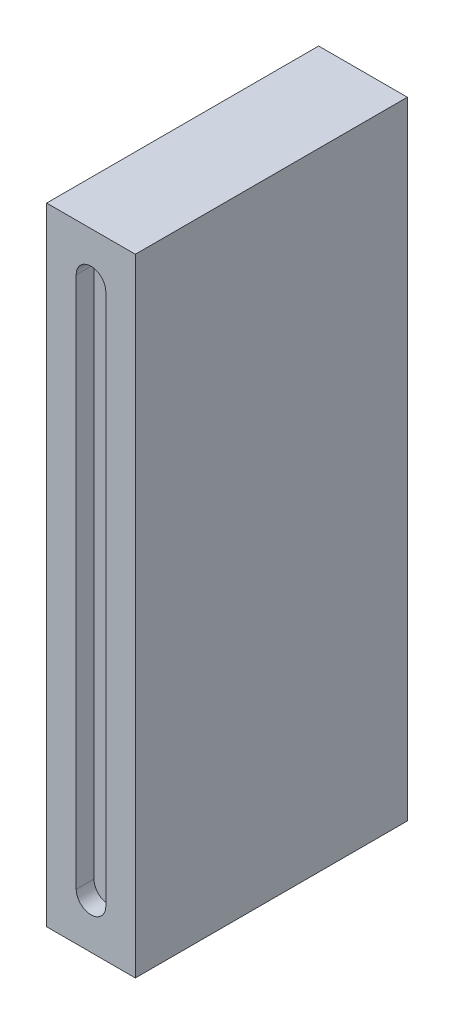
ISO-10303-21;
HEADER;
FILE_DESCRIPTION(('STEP AP214'),'2;1');
FILE_NAME('part.step','',(''),(''),'','','');
FILE_SCHEMA(('AUTOMOTIVE_DESIGN { 1 0 10303 214 1 1 1 1 }'));
ENDSEC;
DATA;
#1=APPLICATION_CONTEXT('core data for automotive mechanical design processes');
#2=APPLICATION_PROTOCOL_DEFINITION('international standard','automotive_design',2000,#1);
#3=PRODUCT_CONTEXT('',#1,'mechanical');
#4=PRODUCT('Part','Part','',(#3));
#5=PRODUCT_RELATED_PRODUCT_CATEGORY('part','',(#4));
#6=PRODUCT_DEFINITION_FORMATION('','',#4);
#7=PRODUCT_DEFINITION_CONTEXT('part definition',#1,'design');
#8=PRODUCT_DEFINITION('design','',#6,#7);
#9=PRODUCT_DEFINITION_SHAPE('','',#8);
#10=(LENGTH_UNIT() NAMED_UNIT(*) SI_UNIT(.MILLI.,.METRE.));
#11=(NAMED_UNIT(*) PLANE_ANGLE_UNIT() SI_UNIT($,.RADIAN.));
#12=(NAMED_UNIT(*) SI_UNIT($,.STERADIAN.) SOLID_ANGLE_UNIT());
#13=UNCERTAINTY_MEASURE_WITH_UNIT(LENGTH_MEASURE(1.E-05),#10,'distance_accuracy_value','');
#14=(GEOMETRIC_REPRESENTATION_CONTEXT(3) GLOBAL_UNCERTAINTY_ASSIGNED_CONTEXT((#13)) GLOBAL_UNIT_ASSIGNED_CONTEXT((#10,
#11,#12)) REPRESENTATION_CONTEXT('',''));
#15=CARTESIAN_POINT('',(0.,0.,0.));
#16=DIRECTION('',(0.,0.,1.));
#17=DIRECTION('',(1.,0.,0.));
#18=AXIS2_PLACEMENT_3D('',#15,#16,#17);
#19=CARTESIAN_POINT('',(0.,0.,-41.));
#20=DIRECTION('',(0.,0.,-1.));
#21=DIRECTION('',(1.,0.,0.));
#22=AXIS2_PLACEMENT_3D('',#19,#20,#21);
#23=PLANE('',#22);
#24=DIRECTION('',(0.,-1.,0.));
#25=VECTOR('',#24,1.);
#26=CARTESIAN_POINT('',(-7.5,-50.,-41.));
#27=LINE('',#26,#25);
#28=CARTESIAN_POINT('',(-7.5,53.,-41.));
#29=VERTEX_POINT('',#28);
#30=CARTESIAN_POINT('',(-7.5,-53.,-41.));
#31=VERTEX_POINT('',#30);
#32=EDGE_CURVE('E252',#29,#31,#27,.T.);
#33=ORIENTED_EDGE('',*,*,#32,.F.);
#34=DIRECTION('',(1.,0.,0.));
#35=VECTOR('',#34,1.);
#36=CARTESIAN_POINT('',(-7.5,53.,-41.));
#37=LINE('',#36,#35);
#38=CARTESIAN_POINT('',(7.5,53.,-41.));
#39=VERTEX_POINT('',#38);
#40=EDGE_CURVE('E171',#29,#39,#37,.T.);
#41=ORIENTED_EDGE('',*,*,#40,.T.);
#42=DIRECTION('',(0.,1.,0.));
#43=VECTOR('',#42,1.);
#44=CARTESIAN_POINT('',(7.5,-50.,-41.));
#45=LINE('',#44,#43);
#46=CARTESIAN_POINT('',(7.5,-53.,-41.));
#47=VERTEX_POINT('',#46);
#48=EDGE_CURVE('E254',#47,#39,#45,.T.);
#49=ORIENTED_EDGE('',*,*,#48,.F.);
#50=DIRECTION('',(1.,0.,0.));
#51=VECTOR('',#50,1.);
#52=CARTESIAN_POINT('',(-7.5,-53.,-41.));
#53=LINE('',#52,#51);
#54=EDGE_CURVE('E184',#31,#47,#53,.T.);
#55=ORIENTED_EDGE('',*,*,#54,.F.);
#56=EDGE_LOOP('',(#33,#41,#49,#55));
#57=FACE_BOUND('',#56,.T.);
#58=DIRECTION('',(0.,1.,0.));
#59=VECTOR('',#58,1.);
#60=CARTESIAN_POINT('',(2.49999999999999,45.,-41.));
#61=LINE('',#60,#59);
#62=CARTESIAN_POINT('',(2.50000000000001,-45.,-41.));
#63=VERTEX_POINT('',#62);
#64=CARTESIAN_POINT('',(2.49999999999999,45.,-41.));
#65=VERTEX_POINT('',#64);
#66=EDGE_CURVE('E206',#63,#65,#61,.T.);
#67=ORIENTED_EDGE('',*,*,#66,.T.);
#68=CARTESIAN_POINT('',(0.,45.,-41.));
#69=DIRECTION('',(0.,0.,1.));
#70=DIRECTION('',(1.,0.,0.));
#71=AXIS2_PLACEMENT_3D('',#68,#69,#70);
#72=CIRCLE('',#71,2.49999999999999);
#73=CARTESIAN_POINT('',(-2.49999999999999,45.,-41.));
#74=VERTEX_POINT('',#73);
#75=EDGE_CURVE('E55',#65,#74,#72,.T.);
#76=ORIENTED_EDGE('',*,*,#75,.T.);
#77=DIRECTION('',(0.,-1.,0.));
#78=VECTOR('',#77,1.);
#79=CARTESIAN_POINT('',(-2.49999999999999,45.,-41.));
#80=LINE('',#79,#78);
#81=CARTESIAN_POINT('',(-2.5,-45.,-41.));
#82=VERTEX_POINT('',#81);
#83=EDGE_CURVE('E198',#74,#82,#80,.T.);
#84=ORIENTED_EDGE('',*,*,#83,.T.);
#85=CARTESIAN_POINT('',(0.,-45.,-41.));
#86=DIRECTION('',(0.,0.,1.));
#87=DIRECTION('',(1.,0.,0.));
#88=AXIS2_PLACEMENT_3D('',#85,#86,#87);
#89=CIRCLE('',#88,2.5);
#90=EDGE_CURVE('E209',#82,#63,#89,.T.);
#91=ORIENTED_EDGE('',*,*,#90,.T.);
#92=EDGE_LOOP('',(#67,#76,#84,#91));
#93=FACE_BOUND('',#92,.T.);
#94=ADVANCED_FACE('F38',(#57,#93),#23,.T.);
#95=CARTESIAN_POINT('',(-7.5,-50.,5.));
#96=DIRECTION('',(1.,0.,0.));
#97=DIRECTION('',(0.,0.,-1.));
#98=AXIS2_PLACEMENT_3D('',#95,#96,#97);
#99=PLANE('',#98);
#100=DIRECTION('',(0.,-1.,0.));
#101=VECTOR('',#100,1.);
#102=CARTESIAN_POINT('',(-7.5,-50.,-36.));
#103=LINE('',#102,#101);
#104=CARTESIAN_POINT('',(-7.5,50.,-36.));
#105=VERTEX_POINT('',#104);
#106=CARTESIAN_POINT('',(-7.5,-50.,-36.));
#107=VERTEX_POINT('',#106);
#108=EDGE_CURVE('E246',#105,#107,#103,.T.);
#109=ORIENTED_EDGE('',*,*,#108,.F.);
#110=DIRECTION('',(0.,0.,-1.));
#111=VECTOR('',#110,1.);
#112=CARTESIAN_POINT('',(-7.5,50.,5.));
#113=LINE('',#112,#111);
#114=CARTESIAN_POINT('',(-7.5,50.,0.));
#115=VERTEX_POINT('',#114);
#116=EDGE_CURVE('E172',#115,#105,#113,.T.);
#117=ORIENTED_EDGE('',*,*,#116,.F.);
#118=DIRECTION('',(0.,-1.,0.));
#119=VECTOR('',#118,1.);
#120=CARTESIAN_POINT('',(-7.5,-50.,0.));
#121=LINE('',#120,#119);
#122=CARTESIAN_POINT('',(-7.5,-50.,0.));
#123=VERTEX_POINT('',#122);
#124=EDGE_CURVE('E273',#115,#123,#121,.T.);
#125=ORIENTED_EDGE('',*,*,#124,.T.);
#126=DIRECTION('',(0.,0.,-1.));
#127=VECTOR('',#126,1.);
#128=CARTESIAN_POINT('',(-7.5,-50.,5.));
#129=LINE('',#128,#127);
#130=EDGE_CURVE('E180',#123,#107,#129,.T.);
#131=ORIENTED_EDGE('',*,*,#130,.T.);
#132=EDGE_LOOP('',(#109,#117,#125,#131));
#133=FACE_BOUND('',#132,.T.);
#134=DIRECTION('',(0.,0.,-1.));
#135=VECTOR('',#134,1.);
#136=CARTESIAN_POINT('',(-7.5,53.,5.));
#137=LINE('',#136,#135);
#138=CARTESIAN_POINT('',(-7.5,53.,5.));
#139=VERTEX_POINT('',#138);
#140=EDGE_CURVE('E155',#139,#29,#137,.T.);
#141=ORIENTED_EDGE('',*,*,#140,.T.);
#142=ORIENTED_EDGE('',*,*,#32,.T.);
#143=DIRECTION('',(0.,0.,-1.));
#144=VECTOR('',#143,1.);
#145=CARTESIAN_POINT('',(-7.5,-53.,5.));
#146=LINE('',#145,#144);
#147=CARTESIAN_POINT('',(-7.5,-53.,5.));
#148=VERTEX_POINT('',#147);
#149=EDGE_CURVE('E158',#148,#31,#146,.T.);
#150=ORIENTED_EDGE('',*,*,#149,.F.);
#151=DIRECTION('',(0.,-1.,0.));
#152=VECTOR('',#151,1.);
#153=CARTESIAN_POINT('',(-7.5,-50.,5.));
#154=LINE('',#153,#152);
#155=EDGE_CURVE('E47',#139,#148,#154,.T.);
#156=ORIENTED_EDGE('',*,*,#155,.F.);
#157=EDGE_LOOP('',(#141,#142,#150,#156));
#158=FACE_BOUND('',#157,.T.);
#159=ADVANCED_FACE('F40',(#133,#158),#99,.F.);
#160=CARTESIAN_POINT('',(7.5,-50.,5.));
#161=DIRECTION('',(-1.,0.,0.));
#162=DIRECTION('',(0.,0.,1.));
#163=AXIS2_PLACEMENT_3D('',#160,#161,#162);
#164=PLANE('',#163);
#165=DIRECTION('',(0.,1.,0.));
#166=VECTOR('',#165,1.);
#167=CARTESIAN_POINT('',(7.5,-50.,5.));
#168=LINE('',#167,#166);
#169=CARTESIAN_POINT('',(7.5,-53.,5.));
#170=VERTEX_POINT('',#169);
#171=CARTESIAN_POINT('',(7.5,53.,5.));
#172=VERTEX_POINT('',#171);
#173=EDGE_CURVE('E11',#170,#172,#168,.T.);
#174=ORIENTED_EDGE('',*,*,#173,.F.);
#175=DIRECTION('',(0.,0.,1.));
#176=VECTOR('',#175,1.);
#177=CARTESIAN_POINT('',(7.5,-53.,5.));
#178=LINE('',#177,#176);
#179=EDGE_CURVE('E187',#47,#170,#178,.T.);
#180=ORIENTED_EDGE('',*,*,#179,.F.);
#181=ORIENTED_EDGE('',*,*,#48,.T.);
#182=DIRECTION('',(0.,0.,1.));
#183=VECTOR('',#182,1.);
#184=CARTESIAN_POINT('',(7.5,53.,5.));
#185=LINE('',#184,#183);
#186=EDGE_CURVE('E175',#39,#172,#185,.T.);
#187=ORIENTED_EDGE('',*,*,#186,.T.);
#188=EDGE_LOOP('',(#174,#180,#181,#187));
#189=FACE_BOUND('',#188,.T.);
#190=ADVANCED_FACE('F302',(#189),#164,.F.);
#191=CARTESIAN_POINT('',(0.,0.,5.));
#192=DIRECTION('',(0.,0.,1.));
#193=DIRECTION('',(1.,0.,0.));
#194=AXIS2_PLACEMENT_3D('',#191,#192,#193);
#195=PLANE('',#194);
#196=CARTESIAN_POINT('',(0.,45.,5.));
#197=DIRECTION('',(0.,0.,1.));
#198=DIRECTION('',(1.,0.,0.));
#199=AXIS2_PLACEMENT_3D('',#196,#197,#198);
#200=CIRCLE('',#199,2.49999999999999);
#201=CARTESIAN_POINT('',(2.49999999999999,45.,5.));
#202=VERTEX_POINT('',#201);
#203=CARTESIAN_POINT('',(-2.49999999999999,45.,5.));
#204=VERTEX_POINT('',#203);
#205=EDGE_CURVE('E63',#202,#204,#200,.T.);
#206=ORIENTED_EDGE('',*,*,#205,.F.);
#207=DIRECTION('',(0.,1.,0.));
#208=VECTOR('',#207,1.);
#209=CARTESIAN_POINT('',(2.49999999999999,45.,5.));
#210=LINE('',#209,#208);
#211=CARTESIAN_POINT('',(2.50000000000001,-45.,5.));
#212=VERTEX_POINT('',#211);
#213=EDGE_CURVE('E225',#212,#202,#210,.T.);
#214=ORIENTED_EDGE('',*,*,#213,.F.);
#215=CARTESIAN_POINT('',(0.,-45.,5.));
#216=DIRECTION('',(0.,0.,1.));
#217=DIRECTION('',(1.,0.,0.));
#218=AXIS2_PLACEMENT_3D('',#215,#216,#217);
#219=CIRCLE('',#218,2.5);
#220=CARTESIAN_POINT('',(-2.5,-45.,5.));
#221=VERTEX_POINT('',#220);
#222=EDGE_CURVE('E239',#221,#212,#219,.T.);
#223=ORIENTED_EDGE('',*,*,#222,.F.);
#224=DIRECTION('',(0.,-1.,0.));
#225=VECTOR('',#224,1.);
#226=CARTESIAN_POINT('',(-2.49999999999999,45.,5.));
#227=LINE('',#226,#225);
#228=EDGE_CURVE('E236',#204,#221,#227,.T.);
#229=ORIENTED_EDGE('',*,*,#228,.F.);
#230=EDGE_LOOP('',(#206,#214,#223,#229));
#231=FACE_BOUND('',#230,.T.);
#232=ORIENTED_EDGE('',*,*,#155,.T.);
#233=DIRECTION('',(-1.,0.,0.));
#234=VECTOR('',#233,1.);
#235=CARTESIAN_POINT('',(-7.5,-53.,5.));
#236=LINE('',#235,#234);
#237=EDGE_CURVE('E190',#170,#148,#236,.T.);
#238=ORIENTED_EDGE('',*,*,#237,.F.);
#239=ORIENTED_EDGE('',*,*,#173,.T.);
#240=DIRECTION('',(-1.,0.,0.));
#241=VECTOR('',#240,1.);
#242=CARTESIAN_POINT('',(-7.5,53.,5.));
#243=LINE('',#242,#241);
#244=EDGE_CURVE('E168',#172,#139,#243,.T.);
#245=ORIENTED_EDGE('',*,*,#244,.T.);
#246=EDGE_LOOP('',(#232,#238,#239,#245));
#247=FACE_BOUND('',#246,.T.);
#248=ADVANCED_FACE('F174',(#231,#247),#195,.T.);
#249=CARTESIAN_POINT('',(0.,0.,0.));
#250=DIRECTION('',(0.,0.,1.));
#251=DIRECTION('',(1.,0.,0.));
#252=AXIS2_PLACEMENT_3D('',#249,#250,#251);
#253=PLANE('',#252);
#254=DIRECTION('',(-1.,0.,0.));
#255=VECTOR('',#254,1.);
#256=CARTESIAN_POINT('',(7.5,50.,0.));
#257=LINE('',#256,#255);
#258=CARTESIAN_POINT('',(2.5,50.,0.));
#259=VERTEX_POINT('',#258);
#260=EDGE_CURVE('E42',#259,#115,#257,.T.);
#261=ORIENTED_EDGE('',*,*,#260,.F.);
#262=DIRECTION('',(0.,-1.,0.));
#263=VECTOR('',#262,1.);
#264=CARTESIAN_POINT('',(2.5,-50.,0.));
#265=LINE('',#264,#263);
#266=CARTESIAN_POINT('',(2.5,-50.,0.));
#267=VERTEX_POINT('',#266);
#268=EDGE_CURVE('E257',#259,#267,#265,.T.);
#269=ORIENTED_EDGE('',*,*,#268,.T.);
#270=DIRECTION('',(1.,0.,0.));
#271=VECTOR('',#270,1.);
#272=CARTESIAN_POINT('',(7.5,-50.,0.));
#273=LINE('',#272,#271);
#274=EDGE_CURVE('E276',#123,#267,#273,.T.);
#275=ORIENTED_EDGE('',*,*,#274,.F.);
#276=ORIENTED_EDGE('',*,*,#124,.F.);
#277=EDGE_LOOP('',(#261,#269,#275,#276));
#278=FACE_BOUND('',#277,.T.);
#279=ADVANCED_FACE('F294',(#278),#253,.F.);
#280=CARTESIAN_POINT('',(2.5,0.,0.));
#281=DIRECTION('',(-1.,0.,0.));
#282=DIRECTION('',(0.,0.,1.));
#283=AXIS2_PLACEMENT_3D('',#280,#281,#282);
#284=PLANE('',#283);
#285=ORIENTED_EDGE('',*,*,#268,.F.);
#286=DIRECTION('',(0.,0.,1.));
#287=VECTOR('',#286,1.);
#288=CARTESIAN_POINT('',(2.5,50.,0.));
#289=LINE('',#288,#287);
#290=CARTESIAN_POINT('',(2.5,50.,-36.));
#291=VERTEX_POINT('',#290);
#292=EDGE_CURVE('E271',#291,#259,#289,.T.);
#293=ORIENTED_EDGE('',*,*,#292,.F.);
#294=DIRECTION('',(0.,1.,0.));
#295=VECTOR('',#294,1.);
#296=CARTESIAN_POINT('',(2.5,-50.,-36.));
#297=LINE('',#296,#295);
#298=CARTESIAN_POINT('',(2.5,-50.,-36.));
#299=VERTEX_POINT('',#298);
#300=EDGE_CURVE('E268',#299,#291,#297,.T.);
#301=ORIENTED_EDGE('',*,*,#300,.F.);
#302=DIRECTION('',(0.,0.,-1.));
#303=VECTOR('',#302,1.);
#304=CARTESIAN_POINT('',(2.5,-50.,0.));
#305=LINE('',#304,#303);
#306=EDGE_CURVE('E266',#267,#299,#305,.T.);
#307=ORIENTED_EDGE('',*,*,#306,.F.);
#308=EDGE_LOOP('',(#285,#293,#301,#307));
#309=FACE_BOUND('',#308,.T.);
#310=ADVANCED_FACE('F293',(#309),#284,.T.);
#311=CARTESIAN_POINT('',(0.,0.,-36.));
#312=DIRECTION('',(0.,0.,-1.));
#313=DIRECTION('',(1.,0.,0.));
#314=AXIS2_PLACEMENT_3D('',#311,#312,#313);
#315=PLANE('',#314);
#316=DIRECTION('',(1.,0.,0.));
#317=VECTOR('',#316,1.);
#318=CARTESIAN_POINT('',(7.5,-50.,-36.));
#319=LINE('',#318,#317);
#320=EDGE_CURVE('E255',#107,#299,#319,.T.);
#321=ORIENTED_EDGE('',*,*,#320,.T.);
#322=ORIENTED_EDGE('',*,*,#300,.T.);
#323=DIRECTION('',(-1.,0.,0.));
#324=VECTOR('',#323,1.);
#325=CARTESIAN_POINT('',(7.5,50.,-36.));
#326=LINE('',#325,#324);
#327=EDGE_CURVE('E260',#291,#105,#326,.T.);
#328=ORIENTED_EDGE('',*,*,#327,.T.);
#329=ORIENTED_EDGE('',*,*,#108,.T.);
#330=EDGE_LOOP('',(#321,#322,#328,#329));
#331=FACE_BOUND('',#330,.T.);
#332=ADVANCED_FACE('F290',(#331),#315,.F.);
#333=CARTESIAN_POINT('',(0.,45.,2.));
#334=DIRECTION('',(0.,0.,1.));
#335=DIRECTION('',(1.,0.,0.));
#336=AXIS2_PLACEMENT_3D('',#333,#334,#335);
#337=CYLINDRICAL_SURFACE('',#336,2.49999999999999);
#338=ORIENTED_EDGE('',*,*,#205,.T.);
#339=DIRECTION('',(0.,0.,1.));
#340=VECTOR('',#339,1.);
#341=CARTESIAN_POINT('',(-2.49999999999999,45.,2.));
#342=LINE('',#341,#340);
#343=CARTESIAN_POINT('',(-2.49999999999999,45.,2.));
#344=VERTEX_POINT('',#343);
#345=EDGE_CURVE('E234',#344,#204,#342,.T.);
#346=ORIENTED_EDGE('',*,*,#345,.F.);
#347=CARTESIAN_POINT('',(0.,45.,2.));
#348=DIRECTION('',(0.,0.,1.));
#349=DIRECTION('',(1.,0.,0.));
#350=AXIS2_PLACEMENT_3D('',#347,#348,#349);
#351=CIRCLE('',#350,2.49999999999999);
#352=CARTESIAN_POINT('',(2.49999999999999,45.,2.));
#353=VERTEX_POINT('',#352);
#354=EDGE_CURVE('E221',#353,#344,#351,.T.);
#355=ORIENTED_EDGE('',*,*,#354,.F.);
#356=DIRECTION('',(0.,0.,1.));
#357=VECTOR('',#356,1.);
#358=CARTESIAN_POINT('',(2.49999999999999,45.,2.));
#359=LINE('',#358,#357);
#360=EDGE_CURVE('E244',#353,#202,#359,.T.);
#361=ORIENTED_EDGE('',*,*,#360,.T.);
#362=EDGE_LOOP('',(#338,#346,#355,#361));
#363=FACE_BOUND('',#362,.T.);
#364=ADVANCED_FACE('F314',(#363),#337,.F.);
#365=CARTESIAN_POINT('',(2.49999999999999,45.,2.));
#366=DIRECTION('',(1.,0.,0.));
#367=DIRECTION('',(0.,1.,0.));
#368=AXIS2_PLACEMENT_3D('',#365,#366,#367);
#369=PLANE('',#368);
#370=ORIENTED_EDGE('',*,*,#213,.T.);
#371=ORIENTED_EDGE('',*,*,#360,.F.);
#372=DIRECTION('',(0.,1.,0.));
#373=VECTOR('',#372,1.);
#374=CARTESIAN_POINT('',(2.49999999999999,45.,2.));
#375=LINE('',#374,#373);
#376=CARTESIAN_POINT('',(2.50000000000001,-45.,2.));
#377=VERTEX_POINT('',#376);
#378=EDGE_CURVE('E231',#377,#353,#375,.T.);
#379=ORIENTED_EDGE('',*,*,#378,.F.);
#380=DIRECTION('',(0.,0.,1.));
#381=VECTOR('',#380,1.);
#382=CARTESIAN_POINT('',(2.50000000000001,-45.,2.));
#383=LINE('',#382,#381);
#384=EDGE_CURVE('E247',#377,#212,#383,.T.);
#385=ORIENTED_EDGE('',*,*,#384,.T.);
#386=EDGE_LOOP('',(#370,#371,#379,#385));
#387=FACE_BOUND('',#386,.T.);
#388=ADVANCED_FACE('F320',(#387),#369,.F.);
#389=CARTESIAN_POINT('',(0.,-45.,2.));
#390=DIRECTION('',(0.,0.,1.));
#391=DIRECTION('',(1.,0.,0.));
#392=AXIS2_PLACEMENT_3D('',#389,#390,#391);
#393=CYLINDRICAL_SURFACE('',#392,2.5);
#394=ORIENTED_EDGE('',*,*,#222,.T.);
#395=ORIENTED_EDGE('',*,*,#384,.F.);
#396=CARTESIAN_POINT('',(0.,-45.,2.));
#397=DIRECTION('',(0.,0.,1.));
#398=DIRECTION('',(1.,0.,0.));
#399=AXIS2_PLACEMENT_3D('',#396,#397,#398);
#400=CIRCLE('',#399,2.5);
#401=CARTESIAN_POINT('',(-2.5,-45.,2.));
#402=VERTEX_POINT('',#401);
#403=EDGE_CURVE('E228',#402,#377,#400,.T.);
#404=ORIENTED_EDGE('',*,*,#403,.F.);
#405=DIRECTION('',(0.,0.,1.));
#406=VECTOR('',#405,1.);
#407=CARTESIAN_POINT('',(-2.5,-45.,2.));
#408=LINE('',#407,#406);
#409=EDGE_CURVE('E249',#402,#221,#408,.T.);
#410=ORIENTED_EDGE('',*,*,#409,.T.);
#411=EDGE_LOOP('',(#394,#395,#404,#410));
#412=FACE_BOUND('',#411,.T.);
#413=ADVANCED_FACE('F324',(#412),#393,.F.);
#414=CARTESIAN_POINT('',(-2.49999999999999,45.,2.));
#415=DIRECTION('',(-1.,0.,0.));
#416=DIRECTION('',(0.,0.,1.));
#417=AXIS2_PLACEMENT_3D('',#414,#415,#416);
#418=PLANE('',#417);
#419=ORIENTED_EDGE('',*,*,#228,.T.);
#420=ORIENTED_EDGE('',*,*,#409,.F.);
#421=DIRECTION('',(0.,-1.,0.));
#422=VECTOR('',#421,1.);
#423=CARTESIAN_POINT('',(-2.49999999999999,45.,2.));
#424=LINE('',#423,#422);
#425=EDGE_CURVE('E224',#344,#402,#424,.T.);
#426=ORIENTED_EDGE('',*,*,#425,.F.);
#427=ORIENTED_EDGE('',*,*,#345,.T.);
#428=EDGE_LOOP('',(#419,#420,#426,#427));
#429=FACE_BOUND('',#428,.T.);
#430=ADVANCED_FACE('F330',(#429),#418,.F.);
#431=CARTESIAN_POINT('',(0.,45.,2.));
#432=DIRECTION('',(0.,0.,1.));
#433=DIRECTION('',(1.,0.,0.));
#434=AXIS2_PLACEMENT_3D('',#431,#432,#433);
#435=PLANE('',#434);
#436=ORIENTED_EDGE('',*,*,#354,.T.);
#437=ORIENTED_EDGE('',*,*,#425,.T.);
#438=ORIENTED_EDGE('',*,*,#403,.T.);
#439=ORIENTED_EDGE('',*,*,#378,.T.);
#440=EDGE_LOOP('',(#436,#437,#438,#439));
#441=FACE_BOUND('',#440,.T.);
#442=ADVANCED_FACE('F334',(#441),#435,.T.);
#443=CARTESIAN_POINT('',(0.,45.,-38.));
#444=DIRECTION('',(0.,0.,-1.));
#445=DIRECTION('',(-1.,0.,0.));
#446=AXIS2_PLACEMENT_3D('',#443,#444,#445);
#447=CYLINDRICAL_SURFACE('',#446,2.49999999999999);
#448=ORIENTED_EDGE('',*,*,#75,.F.);
#449=DIRECTION('',(0.,0.,-1.));
#450=VECTOR('',#449,1.);
#451=CARTESIAN_POINT('',(2.49999999999999,45.,-38.));
#452=LINE('',#451,#450);
#453=CARTESIAN_POINT('',(2.49999999999999,45.,-38.));
#454=VERTEX_POINT('',#453);
#455=EDGE_CURVE('E204',#454,#65,#452,.T.);
#456=ORIENTED_EDGE('',*,*,#455,.F.);
#457=CARTESIAN_POINT('',(0.,45.,-38.));
#458=DIRECTION('',(0.,0.,1.));
#459=DIRECTION('',(1.,0.,0.));
#460=AXIS2_PLACEMENT_3D('',#457,#458,#459);
#461=CIRCLE('',#460,2.49999999999999);
#462=CARTESIAN_POINT('',(-2.49999999999999,45.,-38.));
#463=VERTEX_POINT('',#462);
#464=EDGE_CURVE('E194',#454,#463,#461,.T.);
#465=ORIENTED_EDGE('',*,*,#464,.T.);
#466=DIRECTION('',(0.,0.,-1.));
#467=VECTOR('',#466,1.);
#468=CARTESIAN_POINT('',(-2.49999999999999,45.,-38.));
#469=LINE('',#468,#467);
#470=EDGE_CURVE('E214',#463,#74,#469,.T.);
#471=ORIENTED_EDGE('',*,*,#470,.T.);
#472=EDGE_LOOP('',(#448,#456,#465,#471));
#473=FACE_BOUND('',#472,.T.);
#474=ADVANCED_FACE('F341',(#473),#447,.F.);
#475=CARTESIAN_POINT('',(-2.49999999999999,45.,-38.));
#476=DIRECTION('',(1.,0.,0.));
#477=DIRECTION('',(0.,0.,-1.));
#478=AXIS2_PLACEMENT_3D('',#475,#476,#477);
#479=PLANE('',#478);
#480=ORIENTED_EDGE('',*,*,#83,.F.);
#481=ORIENTED_EDGE('',*,*,#470,.F.);
#482=DIRECTION('',(0.,-1.,0.));
#483=VECTOR('',#482,1.);
#484=CARTESIAN_POINT('',(-2.49999999999999,45.,-38.));
#485=LINE('',#484,#483);
#486=CARTESIAN_POINT('',(-2.5,-45.,-38.));
#487=VERTEX_POINT('',#486);
#488=EDGE_CURVE('E202',#463,#487,#485,.T.);
#489=ORIENTED_EDGE('',*,*,#488,.T.);
#490=DIRECTION('',(0.,0.,-1.));
#491=VECTOR('',#490,1.);
#492=CARTESIAN_POINT('',(-2.5,-45.,-38.));
#493=LINE('',#492,#491);
#494=EDGE_CURVE('E216',#487,#82,#493,.T.);
#495=ORIENTED_EDGE('',*,*,#494,.T.);
#496=EDGE_LOOP('',(#480,#481,#489,#495));
#497=FACE_BOUND('',#496,.T.);
#498=ADVANCED_FACE('F353',(#497),#479,.T.);
#499=CARTESIAN_POINT('',(0.,-45.,-38.));
#500=DIRECTION('',(0.,0.,-1.));
#501=DIRECTION('',(-1.,0.,0.));
#502=AXIS2_PLACEMENT_3D('',#499,#500,#501);
#503=CYLINDRICAL_SURFACE('',#502,2.5);
#504=ORIENTED_EDGE('',*,*,#90,.F.);
#505=ORIENTED_EDGE('',*,*,#494,.F.);
#506=CARTESIAN_POINT('',(0.,-45.,-38.));
#507=DIRECTION('',(0.,0.,1.));
#508=DIRECTION('',(1.,0.,0.));
#509=AXIS2_PLACEMENT_3D('',#506,#507,#508);
#510=CIRCLE('',#509,2.5);
#511=CARTESIAN_POINT('',(2.50000000000001,-45.,-38.));
#512=VERTEX_POINT('',#511);
#513=EDGE_CURVE('E200',#487,#512,#510,.T.);
#514=ORIENTED_EDGE('',*,*,#513,.T.);
#515=DIRECTION('',(0.,0.,-1.));
#516=VECTOR('',#515,1.);
#517=CARTESIAN_POINT('',(2.50000000000001,-45.,-38.));
#518=LINE('',#517,#516);
#519=EDGE_CURVE('E218',#512,#63,#518,.T.);
#520=ORIENTED_EDGE('',*,*,#519,.T.);
#521=EDGE_LOOP('',(#504,#505,#514,#520));
#522=FACE_BOUND('',#521,.T.);
#523=ADVANCED_FACE('F357',(#522),#503,.F.);
#524=CARTESIAN_POINT('',(2.49999999999999,45.,-38.));
#525=DIRECTION('',(-1.,0.,0.));
#526=DIRECTION('',(0.,-1.,0.));
#527=AXIS2_PLACEMENT_3D('',#524,#525,#526);
#528=PLANE('',#527);
#529=ORIENTED_EDGE('',*,*,#66,.F.);
#530=ORIENTED_EDGE('',*,*,#519,.F.);
#531=DIRECTION('',(0.,1.,0.));
#532=VECTOR('',#531,1.);
#533=CARTESIAN_POINT('',(2.49999999999999,45.,-38.));
#534=LINE('',#533,#532);
#535=EDGE_CURVE('E197',#512,#454,#534,.T.);
#536=ORIENTED_EDGE('',*,*,#535,.T.);
#537=ORIENTED_EDGE('',*,*,#455,.T.);
#538=EDGE_LOOP('',(#529,#530,#536,#537));
#539=FACE_BOUND('',#538,.T.);
#540=ADVANCED_FACE('F361',(#539),#528,.T.);
#541=CARTESIAN_POINT('',(0.,45.,-38.));
#542=DIRECTION('',(0.,0.,-1.));
#543=DIRECTION('',(1.,0.,0.));
#544=AXIS2_PLACEMENT_3D('',#541,#542,#543);
#545=PLANE('',#544);
#546=ORIENTED_EDGE('',*,*,#464,.F.);
#547=ORIENTED_EDGE('',*,*,#535,.F.);
#548=ORIENTED_EDGE('',*,*,#513,.F.);
#549=ORIENTED_EDGE('',*,*,#488,.F.);
#550=EDGE_LOOP('',(#546,#547,#548,#549));
#551=FACE_BOUND('',#550,.T.);
#552=ADVANCED_FACE('F364',(#551),#545,.T.);
#553=CARTESIAN_POINT('',(0.,-50.,0.));
#554=DIRECTION('',(0.,-1.,0.));
#555=DIRECTION('',(1.,0.,0.));
#556=AXIS2_PLACEMENT_3D('',#553,#554,#555);
#557=PLANE('',#556);
#558=ORIENTED_EDGE('',*,*,#130,.F.);
#559=ORIENTED_EDGE('',*,*,#274,.T.);
#560=ORIENTED_EDGE('',*,*,#306,.T.);
#561=ORIENTED_EDGE('',*,*,#320,.F.);
#562=EDGE_LOOP('',(#558,#559,#560,#561));
#563=FACE_BOUND('',#562,.T.);
#564=ADVANCED_FACE('F371',(#563),#557,.F.);
#565=CARTESIAN_POINT('',(0.,-53.,0.));
#566=DIRECTION('',(0.,-1.,0.));
#567=DIRECTION('',(1.,0.,0.));
#568=AXIS2_PLACEMENT_3D('',#565,#566,#567);
#569=PLANE('',#568);
#570=ORIENTED_EDGE('',*,*,#149,.T.);
#571=ORIENTED_EDGE('',*,*,#54,.T.);
#572=ORIENTED_EDGE('',*,*,#179,.T.);
#573=ORIENTED_EDGE('',*,*,#237,.T.);
#574=EDGE_LOOP('',(#570,#571,#572,#573));
#575=FACE_BOUND('',#574,.T.);
#576=ADVANCED_FACE('F375',(#575),#569,.T.);
#577=CARTESIAN_POINT('',(0.,53.,0.));
#578=DIRECTION('',(0.,1.,0.));
#579=DIRECTION('',(1.,0.,0.));
#580=AXIS2_PLACEMENT_3D('',#577,#578,#579);
#581=PLANE('',#580);
#582=ORIENTED_EDGE('',*,*,#140,.F.);
#583=ORIENTED_EDGE('',*,*,#244,.F.);
#584=ORIENTED_EDGE('',*,*,#186,.F.);
#585=ORIENTED_EDGE('',*,*,#40,.F.);
#586=EDGE_LOOP('',(#582,#583,#584,#585));
#587=FACE_BOUND('',#586,.T.);
#588=ADVANCED_FACE('F166',(#587),#581,.T.);
#589=CARTESIAN_POINT('',(0.,50.,0.));
#590=DIRECTION('',(0.,1.,0.));
#591=DIRECTION('',(1.,0.,0.));
#592=AXIS2_PLACEMENT_3D('',#589,#590,#591);
#593=PLANE('',#592);
#594=ORIENTED_EDGE('',*,*,#327,.F.);
#595=ORIENTED_EDGE('',*,*,#292,.T.);
#596=ORIENTED_EDGE('',*,*,#260,.T.);
#597=ORIENTED_EDGE('',*,*,#116,.T.);
#598=EDGE_LOOP('',(#594,#595,#596,#597));
#599=FACE_BOUND('',#598,.T.);
#600=ADVANCED_FACE('F285',(#599),#593,.F.);
#601=CLOSED_SHELL('',(#94,#159,#190,#248,#279,#310,#332,#364,#388,#413,#430,#442,#474,#498,#523,
#540,#552,#564,#576,#588,#600));
#602=MANIFOLD_SOLID_BREP('B2',#601);
#603=ADVANCED_BREP_SHAPE_REPRESENTATION('',(#18,#602),#14);
#604=SHAPE_DEFINITION_REPRESENTATION(#9,#603);
ENDSEC;
END-ISO-10303-21;
